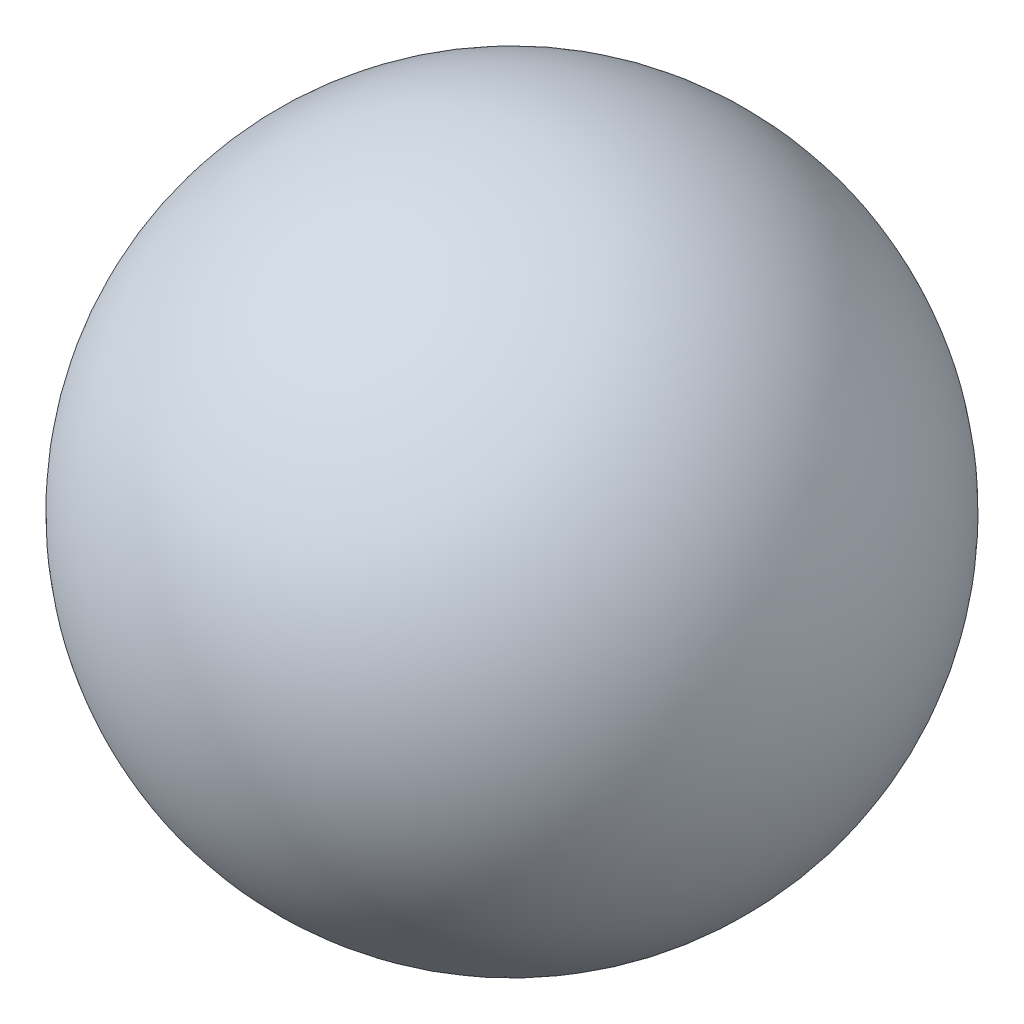
ISO-10303-21;
HEADER;
FILE_DESCRIPTION(('STEP AP214'),'2;1');
FILE_NAME('part.step','',(''),(''),'','','');
FILE_SCHEMA(('AUTOMOTIVE_DESIGN { 1 0 10303 214 1 1 1 1 }'));
ENDSEC;
DATA;
#1=APPLICATION_CONTEXT('core data for automotive mechanical design processes');
#2=APPLICATION_PROTOCOL_DEFINITION('international standard','automotive_design',2000,#1);
#3=PRODUCT_CONTEXT('',#1,'mechanical');
#4=PRODUCT('Part','Part','',(#3));
#5=PRODUCT_RELATED_PRODUCT_CATEGORY('part','',(#4));
#6=PRODUCT_DEFINITION_FORMATION('','',#4);
#7=PRODUCT_DEFINITION_CONTEXT('part definition',#1,'design');
#8=PRODUCT_DEFINITION('design','',#6,#7);
#9=PRODUCT_DEFINITION_SHAPE('','',#8);
#10=(LENGTH_UNIT() NAMED_UNIT(*) SI_UNIT(.MILLI.,.METRE.));
#11=(NAMED_UNIT(*) PLANE_ANGLE_UNIT() SI_UNIT($,.RADIAN.));
#12=(NAMED_UNIT(*) SI_UNIT($,.STERADIAN.) SOLID_ANGLE_UNIT());
#13=UNCERTAINTY_MEASURE_WITH_UNIT(LENGTH_MEASURE(1.E-05),#10,'distance_accuracy_value','');
#14=(GEOMETRIC_REPRESENTATION_CONTEXT(3) GLOBAL_UNCERTAINTY_ASSIGNED_CONTEXT((#13)) GLOBAL_UNIT_ASSIGNED_CONTEXT((#10,
#11,#12)) REPRESENTATION_CONTEXT('',''));
#15=CARTESIAN_POINT('',(0.,0.,0.));
#16=DIRECTION('',(0.,0.,1.));
#17=DIRECTION('',(1.,0.,0.));
#18=AXIS2_PLACEMENT_3D('',#15,#16,#17);
#19=CARTESIAN_POINT('',(0.,0.,0.));
#20=DIRECTION('',(0.,0.,-1.));
#21=DIRECTION('',(1.,0.,0.));
#22=AXIS2_PLACEMENT_3D('',#19,#20,#21);
#23=SPHERICAL_SURFACE('',#22,30.);
#24=CARTESIAN_POINT('',(0.,0.,-30.));
#25=VERTEX_POINT('',#24);
#26=VERTEX_LOOP('',#25);
#27=FACE_BOUND('',#26,.T.);
#28=ADVANCED_FACE('F30',(#27),#23,.T.);
#29=CLOSED_SHELL('',(#28));
#30=MANIFOLD_SOLID_BREP('B2',#29);
#31=ADVANCED_BREP_SHAPE_REPRESENTATION('',(#18,#30),#14);
#32=SHAPE_DEFINITION_REPRESENTATION(#9,#31);
ENDSEC;
END-ISO-10303-21;
